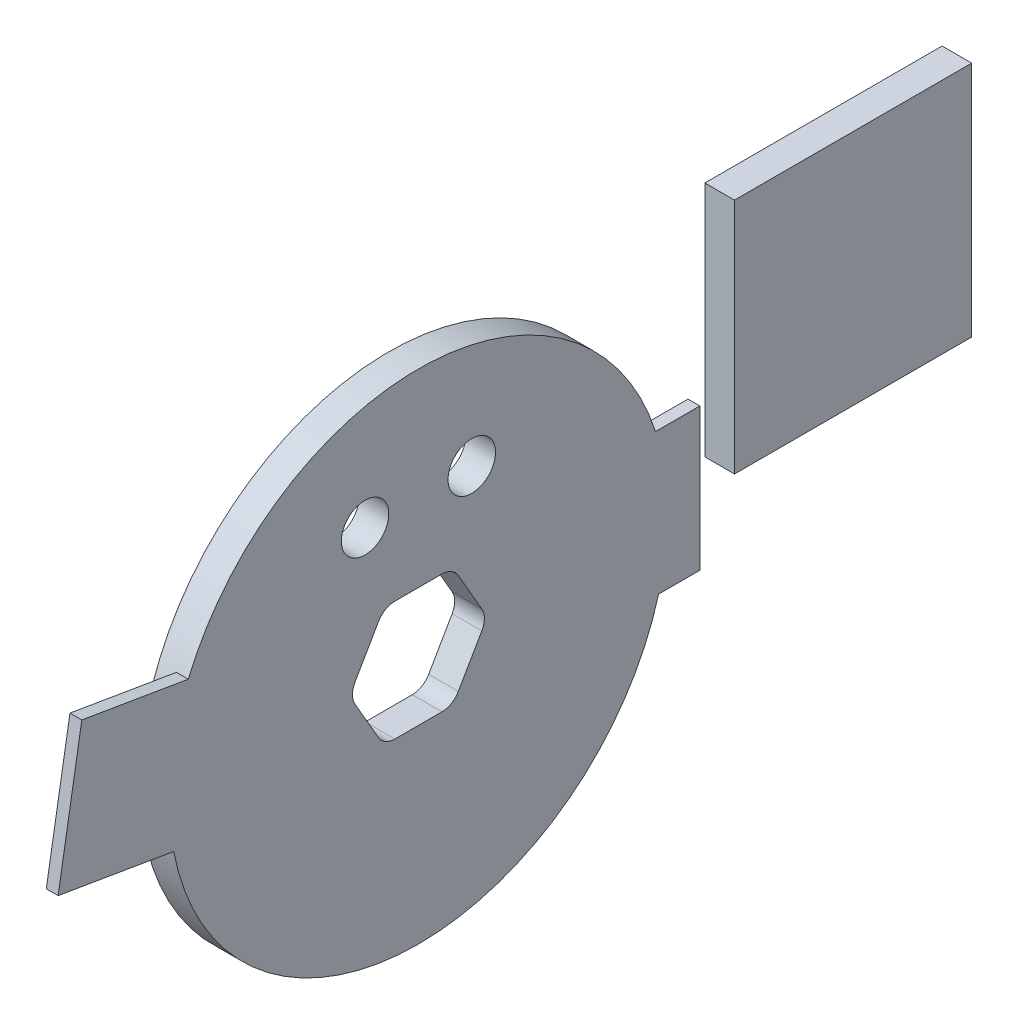
ISO-10303-21;
HEADER;
FILE_DESCRIPTION(('STEP AP214'),'2;1');
FILE_NAME('part.step','',(''),(''),'','','');
FILE_SCHEMA(('AUTOMOTIVE_DESIGN { 1 0 10303 214 1 1 1 1 }'));
ENDSEC;
DATA;
#1=APPLICATION_CONTEXT('core data for automotive mechanical design processes');
#2=APPLICATION_PROTOCOL_DEFINITION('international standard','automotive_design',2000,#1);
#3=PRODUCT_CONTEXT('',#1,'mechanical');
#4=PRODUCT('Part','Part','',(#3));
#5=PRODUCT_RELATED_PRODUCT_CATEGORY('part','',(#4));
#6=PRODUCT_DEFINITION_FORMATION('','',#4);
#7=PRODUCT_DEFINITION_CONTEXT('part definition',#1,'design');
#8=PRODUCT_DEFINITION('design','',#6,#7);
#9=PRODUCT_DEFINITION_SHAPE('','',#8);
#10=(LENGTH_UNIT() NAMED_UNIT(*) SI_UNIT(.MILLI.,.METRE.));
#11=(NAMED_UNIT(*) PLANE_ANGLE_UNIT() SI_UNIT($,.RADIAN.));
#12=(NAMED_UNIT(*) SI_UNIT($,.STERADIAN.) SOLID_ANGLE_UNIT());
#13=UNCERTAINTY_MEASURE_WITH_UNIT(LENGTH_MEASURE(1.E-05),#10,'distance_accuracy_value','');
#14=(GEOMETRIC_REPRESENTATION_CONTEXT(3) GLOBAL_UNCERTAINTY_ASSIGNED_CONTEXT((#13)) GLOBAL_UNIT_ASSIGNED_CONTEXT((#10,
#11,#12)) REPRESENTATION_CONTEXT('',''));
#15=CARTESIAN_POINT('',(0.,0.,0.));
#16=DIRECTION('',(0.,0.,1.));
#17=DIRECTION('',(1.,0.,0.));
#18=AXIS2_PLACEMENT_3D('',#15,#16,#17);
#19=CARTESIAN_POINT('',(-35.9210244842766,0.,-33.8423336393324));
#20=DIRECTION('',(0.,0.,1.));
#21=DIRECTION('',(0.,-1.,0.));
#22=AXIS2_PLACEMENT_3D('',#19,#20,#21);
#23=PLANE('',#22);
#24=DIRECTION('',(0.,1.,0.));
#25=VECTOR('',#24,1.);
#26=CARTESIAN_POINT('',(0.,0.,-33.8423336393324));
#27=LINE('',#26,#25);
#28=CARTESIAN_POINT('',(0.,0.,-33.8423336393324));
#29=VERTEX_POINT('',#28);
#30=CARTESIAN_POINT('',(0.,25.4,-33.8423336393324));
#31=VERTEX_POINT('',#30);
#32=EDGE_CURVE('E54',#29,#31,#27,.T.);
#33=ORIENTED_EDGE('',*,*,#32,.F.);
#34=DIRECTION('',(1.,0.,0.));
#35=VECTOR('',#34,1.);
#36=CARTESIAN_POINT('',(-35.9210244842766,0.,-33.8423336393324));
#37=LINE('',#36,#35);
#38=CARTESIAN_POINT('',(3.175,0.,-33.8423336393324));
#39=VERTEX_POINT('',#38);
#40=EDGE_CURVE('E82',#29,#39,#37,.T.);
#41=ORIENTED_EDGE('',*,*,#40,.T.);
#42=DIRECTION('',(0.,-1.,0.));
#43=VECTOR('',#42,1.);
#44=CARTESIAN_POINT('',(3.175,0.,-33.8423336393324));
#45=LINE('',#44,#43);
#46=CARTESIAN_POINT('',(3.175,25.4,-33.8423336393324));
#47=VERTEX_POINT('',#46);
#48=EDGE_CURVE('E86',#47,#39,#45,.T.);
#49=ORIENTED_EDGE('',*,*,#48,.F.);
#50=DIRECTION('',(1.,0.,0.));
#51=VECTOR('',#50,1.);
#52=CARTESIAN_POINT('',(-35.9210244842766,25.4,-33.8423336393324));
#53=LINE('',#52,#51);
#54=EDGE_CURVE('E109',#31,#47,#53,.T.);
#55=ORIENTED_EDGE('',*,*,#54,.F.);
#56=EDGE_LOOP('',(#33,#41,#49,#55));
#57=FACE_BOUND('',#56,.T.);
#58=ADVANCED_FACE('F46',(#57),#23,.T.);
#59=CARTESIAN_POINT('',(-35.9210244842766,25.4,-33.8423336393324));
#60=DIRECTION('',(0.,1.,0.));
#61=DIRECTION('',(0.,0.,1.));
#62=AXIS2_PLACEMENT_3D('',#59,#60,#61);
#63=PLANE('',#62);
#64=DIRECTION('',(0.,0.,-1.));
#65=VECTOR('',#64,1.);
#66=CARTESIAN_POINT('',(0.,25.4,-33.8423336393324));
#67=LINE('',#66,#65);
#68=CARTESIAN_POINT('',(0.,25.4,-59.2423336393324));
#69=VERTEX_POINT('',#68);
#70=EDGE_CURVE('E60',#31,#69,#67,.T.);
#71=ORIENTED_EDGE('',*,*,#70,.F.);
#72=ORIENTED_EDGE('',*,*,#54,.T.);
#73=DIRECTION('',(0.,0.,1.));
#74=VECTOR('',#73,1.);
#75=CARTESIAN_POINT('',(3.175,25.4,-33.8423336393324));
#76=LINE('',#75,#74);
#77=CARTESIAN_POINT('',(3.175,25.4,-59.2423336393324));
#78=VERTEX_POINT('',#77);
#79=EDGE_CURVE('E91',#78,#47,#76,.T.);
#80=ORIENTED_EDGE('',*,*,#79,.F.);
#81=DIRECTION('',(1.,0.,0.));
#82=VECTOR('',#81,1.);
#83=CARTESIAN_POINT('',(-35.9210244842766,25.4,-59.2423336393324));
#84=LINE('',#83,#82);
#85=EDGE_CURVE('E112',#69,#78,#84,.T.);
#86=ORIENTED_EDGE('',*,*,#85,.F.);
#87=EDGE_LOOP('',(#71,#72,#80,#86));
#88=FACE_BOUND('',#87,.T.);
#89=ADVANCED_FACE('F118',(#88),#63,.T.);
#90=CARTESIAN_POINT('',(-35.9210244842766,0.,-59.2423336393324));
#91=DIRECTION('',(0.,0.,-1.));
#92=DIRECTION('',(0.,1.,0.));
#93=AXIS2_PLACEMENT_3D('',#90,#91,#92);
#94=PLANE('',#93);
#95=DIRECTION('',(0.,-1.,0.));
#96=VECTOR('',#95,1.);
#97=CARTESIAN_POINT('',(0.,0.,-59.2423336393324));
#98=LINE('',#97,#96);
#99=CARTESIAN_POINT('',(0.,0.,-59.2423336393324));
#100=VERTEX_POINT('',#99);
#101=EDGE_CURVE('E111',#69,#100,#98,.T.);
#102=ORIENTED_EDGE('',*,*,#101,.F.);
#103=ORIENTED_EDGE('',*,*,#85,.T.);
#104=DIRECTION('',(0.,1.,0.));
#105=VECTOR('',#104,1.);
#106=CARTESIAN_POINT('',(3.175,0.,-59.2423336393324));
#107=LINE('',#106,#105);
#108=CARTESIAN_POINT('',(3.175,0.,-59.2423336393324));
#109=VERTEX_POINT('',#108);
#110=EDGE_CURVE('E99',#109,#78,#107,.T.);
#111=ORIENTED_EDGE('',*,*,#110,.F.);
#112=DIRECTION('',(1.,0.,0.));
#113=VECTOR('',#112,1.);
#114=CARTESIAN_POINT('',(-35.9210244842766,0.,-59.2423336393324));
#115=LINE('',#114,#113);
#116=EDGE_CURVE('E90',#100,#109,#115,.T.);
#117=ORIENTED_EDGE('',*,*,#116,.F.);
#118=EDGE_LOOP('',(#102,#103,#111,#117));
#119=FACE_BOUND('',#118,.T.);
#120=ADVANCED_FACE('F116',(#119),#94,.T.);
#121=CARTESIAN_POINT('',(-35.9210244842766,0.,-33.8423336393324));
#122=DIRECTION('',(0.,-1.,0.));
#123=DIRECTION('',(0.,0.,-1.));
#124=AXIS2_PLACEMENT_3D('',#121,#122,#123);
#125=PLANE('',#124);
#126=DIRECTION('',(0.,0.,1.));
#127=VECTOR('',#126,1.);
#128=CARTESIAN_POINT('',(0.,0.,-33.8423336393324));
#129=LINE('',#128,#127);
#130=EDGE_CURVE('E13',#100,#29,#129,.T.);
#131=ORIENTED_EDGE('',*,*,#130,.F.);
#132=ORIENTED_EDGE('',*,*,#116,.T.);
#133=DIRECTION('',(0.,0.,-1.));
#134=VECTOR('',#133,1.);
#135=CARTESIAN_POINT('',(3.175,0.,-33.8423336393324));
#136=LINE('',#135,#134);
#137=EDGE_CURVE('E93',#39,#109,#136,.T.);
#138=ORIENTED_EDGE('',*,*,#137,.F.);
#139=ORIENTED_EDGE('',*,*,#40,.F.);
#140=EDGE_LOOP('',(#131,#132,#138,#139));
#141=FACE_BOUND('',#140,.T.);
#142=ADVANCED_FACE('F94',(#141),#125,.T.);
#143=CARTESIAN_POINT('',(3.175,0.,0.));
#144=DIRECTION('',(-1.,0.,0.));
#145=DIRECTION('',(0.,0.,1.));
#146=AXIS2_PLACEMENT_3D('',#143,#144,#145);
#147=PLANE('',#146);
#148=ORIENTED_EDGE('',*,*,#48,.T.);
#149=ORIENTED_EDGE('',*,*,#137,.T.);
#150=ORIENTED_EDGE('',*,*,#110,.T.);
#151=ORIENTED_EDGE('',*,*,#79,.T.);
#152=EDGE_LOOP('',(#148,#149,#150,#151));
#153=FACE_BOUND('',#152,.T.);
#154=ADVANCED_FACE('F101',(#153),#147,.F.);
#155=CARTESIAN_POINT('',(0.,0.,0.));
#156=DIRECTION('',(1.,0.,0.));
#157=DIRECTION('',(0.,0.,-1.));
#158=AXIS2_PLACEMENT_3D('',#155,#156,#157);
#159=PLANE('',#158);
#160=ORIENTED_EDGE('',*,*,#32,.T.);
#161=ORIENTED_EDGE('',*,*,#70,.T.);
#162=ORIENTED_EDGE('',*,*,#101,.T.);
#163=ORIENTED_EDGE('',*,*,#130,.T.);
#164=EDGE_LOOP('',(#160,#161,#162,#163));
#165=FACE_BOUND('',#164,.T.);
#166=ADVANCED_FACE('F120',(#165),#159,.F.);
#167=CLOSED_SHELL('',(#58,#89,#120,#142,#154,#166));
#168=MANIFOLD_SOLID_BREP('B2',#167);
#169=CARTESIAN_POINT('',(3.175,0.,0.));
#170=DIRECTION('',(1.,0.,0.));
#171=DIRECTION('',(0.,0.,-1.));
#172=AXIS2_PLACEMENT_3D('',#169,#170,#171);
#173=PLANE('',#172);
#174=CARTESIAN_POINT('',(3.175,0.,0.));
#175=DIRECTION('',(-1.,0.,0.));
#176=DIRECTION('',(0.,0.,1.));
#177=AXIS2_PLACEMENT_3D('',#174,#175,#176);
#178=CIRCLE('',#177,26.67);
#179=CARTESIAN_POINT('',(3.175,-7.0730037867867,-25.7150056860212));
#180=VERTEX_POINT('',#179);
#181=CARTESIAN_POINT('',(3.175,-4.97628205618739,26.2016319510306));
#182=VERTEX_POINT('',#181);
#183=EDGE_CURVE('E361',#180,#182,#178,.T.);
#184=ORIENTED_EDGE('',*,*,#183,.F.);
#185=DIRECTION('',(0.,0.,-1.));
#186=VECTOR('',#185,1.);
#187=CARTESIAN_POINT('',(3.175,-7.0730037867867,-19.3009896519243));
#188=LINE('',#187,#186);
#189=CARTESIAN_POINT('',(3.175,-7.0730037867867,-30.1331847376147));
#190=VERTEX_POINT('',#189);
#191=EDGE_CURVE('E332',#180,#190,#188,.T.);
#192=ORIENTED_EDGE('',*,*,#191,.T.);
#193=DIRECTION('',(0.,1.,0.));
#194=VECTOR('',#193,1.);
#195=CARTESIAN_POINT('',(3.175,8.1669962132133,-30.1331847376147));
#196=LINE('',#195,#194);
#197=CARTESIAN_POINT('',(3.175,8.1669962132133,-30.1331847376147));
#198=VERTEX_POINT('',#197);
#199=EDGE_CURVE('E320',#190,#198,#196,.T.);
#200=ORIENTED_EDGE('',*,*,#199,.T.);
#201=DIRECTION('',(0.,0.,1.));
#202=VECTOR('',#201,1.);
#203=CARTESIAN_POINT('',(3.175,8.1669962132133,-19.3009896519243));
#204=LINE('',#203,#202);
#205=CARTESIAN_POINT('',(3.175,8.1669962132133,-25.3887587891445));
#206=VERTEX_POINT('',#205);
#207=EDGE_CURVE('E329',#198,#206,#204,.T.);
#208=ORIENTED_EDGE('',*,*,#207,.T.);
#209=CARTESIAN_POINT('',(3.175,10.2149040784678,24.6362463591291));
#210=VERTEX_POINT('',#209);
#211=EDGE_CURVE('E358',#210,#206,#178,.T.);
#212=ORIENTED_EDGE('',*,*,#211,.F.);
#213=DIRECTION('',(0.,0.166275518116075,0.986079333560556));
#214=VECTOR('',#213,1.);
#215=CARTESIAN_POINT('',(3.175,9.46466721300355,20.1870461600168));
#216=LINE('',#215,#214);
#217=CARTESIAN_POINT('',(3.175,12.1375221126456,36.0381287968679));
#218=VERTEX_POINT('',#217);
#219=EDGE_CURVE('E335',#210,#218,#216,.T.);
#220=ORIENTED_EDGE('',*,*,#219,.T.);
#221=DIRECTION('',(0.,-0.986079333560556,0.166275518116075));
#222=VECTOR('',#221,1.);
#223=CARTESIAN_POINT('',(3.175,12.1375221126456,36.0381287968679));
#224=LINE('',#223,#222);
#225=CARTESIAN_POINT('',(3.175,-2.89032693081725,38.5721676929568));
#226=VERTEX_POINT('',#225);
#227=EDGE_CURVE('E348',#218,#226,#224,.T.);
#228=ORIENTED_EDGE('',*,*,#227,.T.);
#229=DIRECTION('',(0.,-0.166275518116075,-0.986079333560556));
#230=VECTOR('',#229,1.);
#231=CARTESIAN_POINT('',(3.175,-5.56318183045933,22.7210850561058));
#232=LINE('',#231,#230);
#233=EDGE_CURVE('E340',#226,#182,#232,.T.);
#234=ORIENTED_EDGE('',*,*,#233,.T.);
#235=EDGE_LOOP('',(#184,#192,#200,#208,#212,#220,#228,#234));
#236=FACE_BOUND('',#235,.T.);
#237=DIRECTION('',(0.,0.,1.));
#238=VECTOR('',#237,1.);
#239=CARTESIAN_POINT('',(3.175,6.3881,-3.68817125461025));
#240=LINE('',#239,#238);
#241=CARTESIAN_POINT('',(3.175,6.3881,-2.51499550761693));
#242=VERTEX_POINT('',#241);
#243=CARTESIAN_POINT('',(3.175,6.3881,2.51499550761693));
#244=VERTEX_POINT('',#243);
#245=EDGE_CURVE('E458',#242,#244,#240,.T.);
#246=ORIENTED_EDGE('',*,*,#245,.F.);
#247=CARTESIAN_POINT('',(3.175,4.3561,-2.51499550761693));
#248=DIRECTION('',(1.,0.,0.));
#249=DIRECTION('',(0.,0.,-1.));
#250=AXIS2_PLACEMENT_3D('',#247,#248,#249);
#251=CIRCLE('',#250,2.032);
#252=CARTESIAN_POINT('',(3.175,5.3721,-4.27475912810691));
#253=VERTEX_POINT('',#252);
#254=EDGE_CURVE('E558',#242,#253,#251,.F.);
#255=ORIENTED_EDGE('',*,*,#254,.T.);
#256=DIRECTION('',(0.,0.866025403784438,0.5));
#257=VECTOR('',#256,1.);
#258=CARTESIAN_POINT('',(3.175,0.,-7.3763425092205));
#259=LINE('',#258,#257);
#260=CARTESIAN_POINT('',(3.175,1.016,-6.78975463572384));
#261=VERTEX_POINT('',#260);
#262=EDGE_CURVE('E379',#261,#253,#259,.T.);
#263=ORIENTED_EDGE('',*,*,#262,.F.);
#264=CARTESIAN_POINT('',(3.175,0.,-5.02999101523386));
#265=DIRECTION('',(1.,0.,0.));
#266=DIRECTION('',(0.,0.,-1.));
#267=AXIS2_PLACEMENT_3D('',#264,#265,#266);
#268=CIRCLE('',#267,2.032);
#269=CARTESIAN_POINT('',(3.175,-1.016,-6.78975463572384));
#270=VERTEX_POINT('',#269);
#271=EDGE_CURVE('E552',#261,#270,#268,.F.);
#272=ORIENTED_EDGE('',*,*,#271,.T.);
#273=DIRECTION('',(0.,0.866025403784439,-0.5));
#274=VECTOR('',#273,1.);
#275=CARTESIAN_POINT('',(3.175,-6.3881,-3.68817125461025));
#276=LINE('',#275,#274);
#277=CARTESIAN_POINT('',(3.175,-5.3721,-4.27475912810691));
#278=VERTEX_POINT('',#277);
#279=EDGE_CURVE('E386',#278,#270,#276,.T.);
#280=ORIENTED_EDGE('',*,*,#279,.F.);
#281=CARTESIAN_POINT('',(3.175,-4.3561,-2.51499550761693));
#282=DIRECTION('',(1.,0.,0.));
#283=DIRECTION('',(0.,0.,-1.));
#284=AXIS2_PLACEMENT_3D('',#281,#282,#283);
#285=CIRCLE('',#284,2.032);
#286=CARTESIAN_POINT('',(3.175,-6.3881,-2.51499550761693));
#287=VERTEX_POINT('',#286);
#288=EDGE_CURVE('E449',#278,#287,#285,.F.);
#289=ORIENTED_EDGE('',*,*,#288,.T.);
#290=DIRECTION('',(0.,0.,-1.));
#291=VECTOR('',#290,1.);
#292=CARTESIAN_POINT('',(3.175,-6.3881,3.68817125461024));
#293=LINE('',#292,#291);
#294=CARTESIAN_POINT('',(3.175,-6.3881,2.51499550761692));
#295=VERTEX_POINT('',#294);
#296=EDGE_CURVE('E467',#295,#287,#293,.T.);
#297=ORIENTED_EDGE('',*,*,#296,.F.);
#298=CARTESIAN_POINT('',(3.175,-4.3561,2.51499550761692));
#299=DIRECTION('',(1.,0.,0.));
#300=DIRECTION('',(0.,0.,-1.));
#301=AXIS2_PLACEMENT_3D('',#298,#299,#300);
#302=CIRCLE('',#301,2.032);
#303=CARTESIAN_POINT('',(3.175,-5.3721,4.2747591281069));
#304=VERTEX_POINT('',#303);
#305=EDGE_CURVE('E443',#295,#304,#302,.F.);
#306=ORIENTED_EDGE('',*,*,#305,.T.);
#307=DIRECTION('',(0.,-0.866025403784438,-0.5));
#308=VECTOR('',#307,1.);
#309=CARTESIAN_POINT('',(3.175,0.,7.3763425092205));
#310=LINE('',#309,#308);
#311=CARTESIAN_POINT('',(3.175,-1.016,6.78975463572383));
#312=VERTEX_POINT('',#311);
#313=EDGE_CURVE('E464',#312,#304,#310,.T.);
#314=ORIENTED_EDGE('',*,*,#313,.F.);
#315=CARTESIAN_POINT('',(3.175,0.,5.02999101523385));
#316=DIRECTION('',(1.,0.,0.));
#317=DIRECTION('',(0.,0.,-1.));
#318=AXIS2_PLACEMENT_3D('',#315,#316,#317);
#319=CIRCLE('',#318,2.032);
#320=CARTESIAN_POINT('',(3.175,1.016,6.78975463572383));
#321=VERTEX_POINT('',#320);
#322=EDGE_CURVE('E444',#312,#321,#319,.F.);
#323=ORIENTED_EDGE('',*,*,#322,.T.);
#324=DIRECTION('',(0.,-0.866025403784439,0.5));
#325=VECTOR('',#324,1.);
#326=CARTESIAN_POINT('',(3.175,6.3881,3.68817125461025));
#327=LINE('',#326,#325);
#328=CARTESIAN_POINT('',(3.175,5.3721,4.27475912810691));
#329=VERTEX_POINT('',#328);
#330=EDGE_CURVE('E461',#329,#321,#327,.T.);
#331=ORIENTED_EDGE('',*,*,#330,.F.);
#332=CARTESIAN_POINT('',(3.175,4.3561,2.51499550761693));
#333=DIRECTION('',(1.,0.,0.));
#334=DIRECTION('',(0.,0.,-1.));
#335=AXIS2_PLACEMENT_3D('',#332,#333,#334);
#336=CIRCLE('',#335,2.032);
#337=EDGE_CURVE('E417',#329,#244,#336,.F.);
#338=ORIENTED_EDGE('',*,*,#337,.T.);
#339=EDGE_LOOP('',(#246,#255,#263,#272,#280,#289,#297,#306,#314,#323,#331,#338));
#340=FACE_BOUND('',#339,.T.);
#341=CARTESIAN_POINT('',(3.175,14.8106178129071,5.715));
#342=DIRECTION('',(-1.,0.,0.));
#343=DIRECTION('',(0.,0.,1.));
#344=AXIS2_PLACEMENT_3D('',#341,#342,#343);
#345=CIRCLE('',#344,2.54);
#346=CARTESIAN_POINT('',(3.175,14.8106178129071,8.255));
#347=VERTEX_POINT('',#346);
#348=EDGE_CURVE('E455',#347,#347,#345,.T.);
#349=ORIENTED_EDGE('',*,*,#348,.T.);
#350=EDGE_LOOP('',(#349));
#351=FACE_BOUND('',#350,.T.);
#352=CARTESIAN_POINT('',(3.175,14.8106178129071,-5.715));
#353=DIRECTION('',(-1.,0.,0.));
#354=DIRECTION('',(0.,0.,1.));
#355=AXIS2_PLACEMENT_3D('',#352,#353,#354);
#356=CIRCLE('',#355,2.54);
#357=CARTESIAN_POINT('',(3.175,14.8106178129071,-3.175));
#358=VERTEX_POINT('',#357);
#359=EDGE_CURVE('E365',#358,#358,#356,.T.);
#360=ORIENTED_EDGE('',*,*,#359,.T.);
#361=EDGE_LOOP('',(#360));
#362=FACE_BOUND('',#361,.T.);
#363=ADVANCED_FACE('F171',(#236,#340,#351,#362),#173,.T.);
#364=CARTESIAN_POINT('',(0.,0.,0.));
#365=DIRECTION('',(1.,0.,0.));
#366=DIRECTION('',(0.,0.,-1.));
#367=AXIS2_PLACEMENT_3D('',#364,#365,#366);
#368=PLANE('',#367);
#369=DIRECTION('',(0.,0.866025403784439,-0.5));
#370=VECTOR('',#369,1.);
#371=CARTESIAN_POINT('',(0.,-6.3881,-3.68817125461025));
#372=LINE('',#371,#370);
#373=CARTESIAN_POINT('',(0.,-5.3721,-4.27475912810691));
#374=VERTEX_POINT('',#373);
#375=CARTESIAN_POINT('',(0.,-1.016,-6.78975463572384));
#376=VERTEX_POINT('',#375);
#377=EDGE_CURVE('E374',#374,#376,#372,.T.);
#378=ORIENTED_EDGE('',*,*,#377,.T.);
#379=CARTESIAN_POINT('',(0.,0.,-5.02999101523386));
#380=DIRECTION('',(1.,0.,0.));
#381=DIRECTION('',(0.,0.,-1.));
#382=AXIS2_PLACEMENT_3D('',#379,#380,#381);
#383=CIRCLE('',#382,2.032);
#384=CARTESIAN_POINT('',(0.,1.016,-6.78975463572384));
#385=VERTEX_POINT('',#384);
#386=EDGE_CURVE('E556',#376,#385,#383,.T.);
#387=ORIENTED_EDGE('',*,*,#386,.T.);
#388=DIRECTION('',(0.,0.866025403784438,0.5));
#389=VECTOR('',#388,1.);
#390=CARTESIAN_POINT('',(0.,0.,-7.3763425092205));
#391=LINE('',#390,#389);
#392=CARTESIAN_POINT('',(0.,5.3721,-4.27475912810691));
#393=VERTEX_POINT('',#392);
#394=EDGE_CURVE('E471',#385,#393,#391,.T.);
#395=ORIENTED_EDGE('',*,*,#394,.T.);
#396=CARTESIAN_POINT('',(0.,4.3561,-2.51499550761693));
#397=DIRECTION('',(1.,0.,0.));
#398=DIRECTION('',(0.,0.,-1.));
#399=AXIS2_PLACEMENT_3D('',#396,#397,#398);
#400=CIRCLE('',#399,2.032);
#401=CARTESIAN_POINT('',(0.,6.3881,-2.51499550761693));
#402=VERTEX_POINT('',#401);
#403=EDGE_CURVE('E555',#393,#402,#400,.T.);
#404=ORIENTED_EDGE('',*,*,#403,.T.);
#405=DIRECTION('',(0.,0.,1.));
#406=VECTOR('',#405,1.);
#407=CARTESIAN_POINT('',(0.,6.3881,-3.68817125461025));
#408=LINE('',#407,#406);
#409=CARTESIAN_POINT('',(0.,6.3881,2.51499550761693));
#410=VERTEX_POINT('',#409);
#411=EDGE_CURVE('E430',#402,#410,#408,.T.);
#412=ORIENTED_EDGE('',*,*,#411,.T.);
#413=CARTESIAN_POINT('',(0.,4.3561,2.51499550761693));
#414=DIRECTION('',(1.,0.,0.));
#415=DIRECTION('',(0.,0.,-1.));
#416=AXIS2_PLACEMENT_3D('',#413,#414,#415);
#417=CIRCLE('',#416,2.032);
#418=CARTESIAN_POINT('',(0.,5.3721,4.27475912810691));
#419=VERTEX_POINT('',#418);
#420=EDGE_CURVE('E414',#410,#419,#417,.T.);
#421=ORIENTED_EDGE('',*,*,#420,.T.);
#422=DIRECTION('',(0.,-0.866025403784439,0.5));
#423=VECTOR('',#422,1.);
#424=CARTESIAN_POINT('',(0.,6.3881,3.68817125461025));
#425=LINE('',#424,#423);
#426=CARTESIAN_POINT('',(0.,1.016,6.78975463572383));
#427=VERTEX_POINT('',#426);
#428=EDGE_CURVE('E426',#419,#427,#425,.T.);
#429=ORIENTED_EDGE('',*,*,#428,.T.);
#430=CARTESIAN_POINT('',(0.,0.,5.02999101523385));
#431=DIRECTION('',(1.,0.,0.));
#432=DIRECTION('',(0.,0.,-1.));
#433=AXIS2_PLACEMENT_3D('',#430,#431,#432);
#434=CIRCLE('',#433,2.032);
#435=CARTESIAN_POINT('',(0.,-1.016,6.78975463572383));
#436=VERTEX_POINT('',#435);
#437=EDGE_CURVE('E773',#427,#436,#434,.T.);
#438=ORIENTED_EDGE('',*,*,#437,.T.);
#439=DIRECTION('',(0.,-0.866025403784438,-0.5));
#440=VECTOR('',#439,1.);
#441=CARTESIAN_POINT('',(0.,0.,7.3763425092205));
#442=LINE('',#441,#440);
#443=CARTESIAN_POINT('',(0.,-5.3721,4.2747591281069));
#444=VERTEX_POINT('',#443);
#445=EDGE_CURVE('E429',#436,#444,#442,.T.);
#446=ORIENTED_EDGE('',*,*,#445,.T.);
#447=CARTESIAN_POINT('',(0.,-4.3561,2.51499550761692));
#448=DIRECTION('',(1.,0.,0.));
#449=DIRECTION('',(0.,0.,-1.));
#450=AXIS2_PLACEMENT_3D('',#447,#448,#449);
#451=CIRCLE('',#450,2.032);
#452=CARTESIAN_POINT('',(0.,-6.3881,2.51499550761692));
#453=VERTEX_POINT('',#452);
#454=EDGE_CURVE('E439',#444,#453,#451,.T.);
#455=ORIENTED_EDGE('',*,*,#454,.T.);
#456=DIRECTION('',(0.,0.,-1.));
#457=VECTOR('',#456,1.);
#458=CARTESIAN_POINT('',(0.,-6.3881,3.68817125461024));
#459=LINE('',#458,#457);
#460=CARTESIAN_POINT('',(0.,-6.3881,-2.51499550761693));
#461=VERTEX_POINT('',#460);
#462=EDGE_CURVE('E380',#453,#461,#459,.T.);
#463=ORIENTED_EDGE('',*,*,#462,.T.);
#464=CARTESIAN_POINT('',(0.,-4.3561,-2.51499550761693));
#465=DIRECTION('',(1.,0.,0.));
#466=DIRECTION('',(0.,0.,-1.));
#467=AXIS2_PLACEMENT_3D('',#464,#465,#466);
#468=CIRCLE('',#467,2.032);
#469=EDGE_CURVE('E446',#461,#374,#468,.T.);
#470=ORIENTED_EDGE('',*,*,#469,.T.);
#471=EDGE_LOOP('',(#378,#387,#395,#404,#412,#421,#429,#438,#446,#455,#463,#470));
#472=FACE_BOUND('',#471,.T.);
#473=CARTESIAN_POINT('',(0.,14.8106178129071,5.715));
#474=DIRECTION('',(-1.,0.,0.));
#475=DIRECTION('',(0.,0.,1.));
#476=AXIS2_PLACEMENT_3D('',#473,#474,#475);
#477=CIRCLE('',#476,2.54);
#478=CARTESIAN_POINT('',(0.,14.8106178129071,8.255));
#479=VERTEX_POINT('',#478);
#480=EDGE_CURVE('E360',#479,#479,#477,.T.);
#481=ORIENTED_EDGE('',*,*,#480,.F.);
#482=EDGE_LOOP('',(#481));
#483=FACE_BOUND('',#482,.T.);
#484=CARTESIAN_POINT('',(0.,14.8106178129071,-5.715));
#485=DIRECTION('',(-1.,0.,0.));
#486=DIRECTION('',(0.,0.,1.));
#487=AXIS2_PLACEMENT_3D('',#484,#485,#486);
#488=CIRCLE('',#487,2.54);
#489=CARTESIAN_POINT('',(0.,14.8106178129071,-3.175));
#490=VERTEX_POINT('',#489);
#491=EDGE_CURVE('E478',#490,#490,#488,.T.);
#492=ORIENTED_EDGE('',*,*,#491,.F.);
#493=EDGE_LOOP('',(#492));
#494=FACE_BOUND('',#493,.T.);
#495=CARTESIAN_POINT('',(0.,0.,0.));
#496=DIRECTION('',(-1.,0.,0.));
#497=DIRECTION('',(0.,0.,1.));
#498=AXIS2_PLACEMENT_3D('',#495,#496,#497);
#499=CIRCLE('',#498,26.67);
#500=CARTESIAN_POINT('',(0.,0.,26.67));
#501=VERTEX_POINT('',#500);
#502=EDGE_CURVE('E355',#501,#501,#499,.T.);
#503=ORIENTED_EDGE('',*,*,#502,.T.);
#504=EDGE_LOOP('',(#503));
#505=FACE_BOUND('',#504,.T.);
#506=ADVANCED_FACE('F496',(#472,#483,#494,#505),#368,.F.);
#507=CARTESIAN_POINT('',(3.175,0.,-7.3763425092205));
#508=DIRECTION('',(0.,-0.5,0.866025403784438));
#509=DIRECTION('',(0.,-0.866025403784439,-0.5));
#510=AXIS2_PLACEMENT_3D('',#507,#508,#509);
#511=PLANE('',#510);
#512=ORIENTED_EDGE('',*,*,#394,.F.);
#513=DIRECTION('',(-1.,0.,0.));
#514=VECTOR('',#513,1.);
#515=CARTESIAN_POINT('',(3.175,1.016,-6.78975463572384));
#516=LINE('',#515,#514);
#517=EDGE_CURVE('E412',#385,#261,#516,.F.);
#518=ORIENTED_EDGE('',*,*,#517,.T.);
#519=ORIENTED_EDGE('',*,*,#262,.T.);
#520=DIRECTION('',(-1.,0.,0.));
#521=VECTOR('',#520,1.);
#522=CARTESIAN_POINT('',(0.,5.3721,-4.27475912810691));
#523=LINE('',#522,#521);
#524=EDGE_CURVE('E409',#253,#393,#523,.T.);
#525=ORIENTED_EDGE('',*,*,#524,.T.);
#526=EDGE_LOOP('',(#512,#518,#519,#525));
#527=FACE_BOUND('',#526,.T.);
#528=ADVANCED_FACE('F499',(#527),#511,.T.);
#529=CARTESIAN_POINT('',(3.175,6.3881,-3.68817125461025));
#530=DIRECTION('',(0.,-1.,0.));
#531=DIRECTION('',(0.,0.,-1.));
#532=AXIS2_PLACEMENT_3D('',#529,#530,#531);
#533=PLANE('',#532);
#534=ORIENTED_EDGE('',*,*,#245,.T.);
#535=DIRECTION('',(-1.,0.,0.));
#536=VECTOR('',#535,1.);
#537=CARTESIAN_POINT('',(0.,6.3881,2.51499550761693));
#538=LINE('',#537,#536);
#539=EDGE_CURVE('E385',#244,#410,#538,.T.);
#540=ORIENTED_EDGE('',*,*,#539,.T.);
#541=ORIENTED_EDGE('',*,*,#411,.F.);
#542=DIRECTION('',(-1.,0.,0.));
#543=VECTOR('',#542,1.);
#544=CARTESIAN_POINT('',(3.175,6.3881,-2.51499550761693));
#545=LINE('',#544,#543);
#546=EDGE_CURVE('E383',#402,#242,#545,.F.);
#547=ORIENTED_EDGE('',*,*,#546,.T.);
#548=EDGE_LOOP('',(#534,#540,#541,#547));
#549=FACE_BOUND('',#548,.T.);
#550=ADVANCED_FACE('F740',(#549),#533,.T.);
#551=CARTESIAN_POINT('',(3.175,6.3881,3.68817125461025));
#552=DIRECTION('',(0.,-0.5,-0.866025403784439));
#553=DIRECTION('',(0.,0.866025403784439,-0.5));
#554=AXIS2_PLACEMENT_3D('',#551,#552,#553);
#555=PLANE('',#554);
#556=ORIENTED_EDGE('',*,*,#428,.F.);
#557=DIRECTION('',(-1.,0.,0.));
#558=VECTOR('',#557,1.);
#559=CARTESIAN_POINT('',(3.175,5.3721,4.27475912810691));
#560=LINE('',#559,#558);
#561=EDGE_CURVE('E392',#419,#329,#560,.F.);
#562=ORIENTED_EDGE('',*,*,#561,.T.);
#563=ORIENTED_EDGE('',*,*,#330,.T.);
#564=DIRECTION('',(-1.,0.,0.));
#565=VECTOR('',#564,1.);
#566=CARTESIAN_POINT('',(0.,1.016,6.78975463572383));
#567=LINE('',#566,#565);
#568=EDGE_CURVE('E389',#321,#427,#567,.T.);
#569=ORIENTED_EDGE('',*,*,#568,.T.);
#570=EDGE_LOOP('',(#556,#562,#563,#569));
#571=FACE_BOUND('',#570,.T.);
#572=ADVANCED_FACE('F730',(#571),#555,.T.);
#573=CARTESIAN_POINT('',(3.175,0.,7.3763425092205));
#574=DIRECTION('',(0.,0.5,-0.866025403784438));
#575=DIRECTION('',(0.,0.866025403784439,0.5));
#576=AXIS2_PLACEMENT_3D('',#573,#574,#575);
#577=PLANE('',#576);
#578=ORIENTED_EDGE('',*,*,#445,.F.);
#579=DIRECTION('',(-1.,0.,0.));
#580=VECTOR('',#579,1.);
#581=CARTESIAN_POINT('',(3.175,-1.016,6.78975463572383));
#582=LINE('',#581,#580);
#583=EDGE_CURVE('E397',#436,#312,#582,.F.);
#584=ORIENTED_EDGE('',*,*,#583,.T.);
#585=ORIENTED_EDGE('',*,*,#313,.T.);
#586=DIRECTION('',(-1.,0.,0.));
#587=VECTOR('',#586,1.);
#588=CARTESIAN_POINT('',(0.,-5.3721,4.2747591281069));
#589=LINE('',#588,#587);
#590=EDGE_CURVE('E394',#304,#444,#589,.T.);
#591=ORIENTED_EDGE('',*,*,#590,.T.);
#592=EDGE_LOOP('',(#578,#584,#585,#591));
#593=FACE_BOUND('',#592,.T.);
#594=ADVANCED_FACE('F720',(#593),#577,.T.);
#595=CARTESIAN_POINT('',(3.175,-6.3881,3.68817125461024));
#596=DIRECTION('',(0.,1.,0.));
#597=DIRECTION('',(0.,0.,1.));
#598=AXIS2_PLACEMENT_3D('',#595,#596,#597);
#599=PLANE('',#598);
#600=ORIENTED_EDGE('',*,*,#462,.F.);
#601=DIRECTION('',(-1.,0.,0.));
#602=VECTOR('',#601,1.);
#603=CARTESIAN_POINT('',(3.175,-6.3881,2.51499550761692));
#604=LINE('',#603,#602);
#605=EDGE_CURVE('E402',#453,#295,#604,.F.);
#606=ORIENTED_EDGE('',*,*,#605,.T.);
#607=ORIENTED_EDGE('',*,*,#296,.T.);
#608=DIRECTION('',(-1.,0.,0.));
#609=VECTOR('',#608,1.);
#610=CARTESIAN_POINT('',(0.,-6.3881,-2.51499550761693));
#611=LINE('',#610,#609);
#612=EDGE_CURVE('E399',#287,#461,#611,.T.);
#613=ORIENTED_EDGE('',*,*,#612,.T.);
#614=EDGE_LOOP('',(#600,#606,#607,#613));
#615=FACE_BOUND('',#614,.T.);
#616=ADVANCED_FACE('F710',(#615),#599,.T.);
#617=CARTESIAN_POINT('',(3.175,-6.3881,-3.68817125461025));
#618=DIRECTION('',(0.,0.5,0.866025403784439));
#619=DIRECTION('',(0.,-0.866025403784439,0.5));
#620=AXIS2_PLACEMENT_3D('',#617,#618,#619);
#621=PLANE('',#620);
#622=ORIENTED_EDGE('',*,*,#377,.F.);
#623=DIRECTION('',(-1.,0.,0.));
#624=VECTOR('',#623,1.);
#625=CARTESIAN_POINT('',(3.175,-5.3721,-4.27475912810691));
#626=LINE('',#625,#624);
#627=EDGE_CURVE('E407',#374,#278,#626,.F.);
#628=ORIENTED_EDGE('',*,*,#627,.T.);
#629=ORIENTED_EDGE('',*,*,#279,.T.);
#630=DIRECTION('',(-1.,0.,0.));
#631=VECTOR('',#630,1.);
#632=CARTESIAN_POINT('',(0.,-1.016,-6.78975463572384));
#633=LINE('',#632,#631);
#634=EDGE_CURVE('E404',#270,#376,#633,.T.);
#635=ORIENTED_EDGE('',*,*,#634,.T.);
#636=EDGE_LOOP('',(#622,#628,#629,#635));
#637=FACE_BOUND('',#636,.T.);
#638=ADVANCED_FACE('F530',(#637),#621,.T.);
#639=CARTESIAN_POINT('',(3.175,4.3561,2.51499550761693));
#640=DIRECTION('',(1.,0.,0.));
#641=DIRECTION('',(0.,0.,-1.));
#642=AXIS2_PLACEMENT_3D('',#639,#640,#641);
#643=CYLINDRICAL_SURFACE('',#642,2.032);
#644=ORIENTED_EDGE('',*,*,#337,.F.);
#645=ORIENTED_EDGE('',*,*,#561,.F.);
#646=ORIENTED_EDGE('',*,*,#420,.F.);
#647=ORIENTED_EDGE('',*,*,#539,.F.);
#648=EDGE_LOOP('',(#644,#645,#646,#647));
#649=FACE_BOUND('',#648,.T.);
#650=ADVANCED_FACE('F526',(#649),#643,.F.);
#651=CARTESIAN_POINT('',(3.175,0.,5.02999101523385));
#652=DIRECTION('',(1.,0.,0.));
#653=DIRECTION('',(0.,0.,-1.));
#654=AXIS2_PLACEMENT_3D('',#651,#652,#653);
#655=CYLINDRICAL_SURFACE('',#654,2.032);
#656=ORIENTED_EDGE('',*,*,#322,.F.);
#657=ORIENTED_EDGE('',*,*,#583,.F.);
#658=ORIENTED_EDGE('',*,*,#437,.F.);
#659=ORIENTED_EDGE('',*,*,#568,.F.);
#660=EDGE_LOOP('',(#656,#657,#658,#659));
#661=FACE_BOUND('',#660,.T.);
#662=ADVANCED_FACE('F529',(#661),#655,.F.);
#663=CARTESIAN_POINT('',(3.175,-4.3561,2.51499550761692));
#664=DIRECTION('',(1.,0.,0.));
#665=DIRECTION('',(0.,0.,-1.));
#666=AXIS2_PLACEMENT_3D('',#663,#664,#665);
#667=CYLINDRICAL_SURFACE('',#666,2.032);
#668=ORIENTED_EDGE('',*,*,#305,.F.);
#669=ORIENTED_EDGE('',*,*,#605,.F.);
#670=ORIENTED_EDGE('',*,*,#454,.F.);
#671=ORIENTED_EDGE('',*,*,#590,.F.);
#672=EDGE_LOOP('',(#668,#669,#670,#671));
#673=FACE_BOUND('',#672,.T.);
#674=ADVANCED_FACE('F534',(#673),#667,.F.);
#675=CARTESIAN_POINT('',(3.175,-4.3561,-2.51499550761693));
#676=DIRECTION('',(1.,0.,0.));
#677=DIRECTION('',(0.,0.,-1.));
#678=AXIS2_PLACEMENT_3D('',#675,#676,#677);
#679=CYLINDRICAL_SURFACE('',#678,2.032);
#680=ORIENTED_EDGE('',*,*,#288,.F.);
#681=ORIENTED_EDGE('',*,*,#627,.F.);
#682=ORIENTED_EDGE('',*,*,#469,.F.);
#683=ORIENTED_EDGE('',*,*,#612,.F.);
#684=EDGE_LOOP('',(#680,#681,#682,#683));
#685=FACE_BOUND('',#684,.T.);
#686=ADVANCED_FACE('F538',(#685),#679,.F.);
#687=CARTESIAN_POINT('',(3.175,0.,-5.02999101523386));
#688=DIRECTION('',(1.,0.,0.));
#689=DIRECTION('',(0.,0.,-1.));
#690=AXIS2_PLACEMENT_3D('',#687,#688,#689);
#691=CYLINDRICAL_SURFACE('',#690,2.032);
#692=ORIENTED_EDGE('',*,*,#271,.F.);
#693=ORIENTED_EDGE('',*,*,#517,.F.);
#694=ORIENTED_EDGE('',*,*,#386,.F.);
#695=ORIENTED_EDGE('',*,*,#634,.F.);
#696=EDGE_LOOP('',(#692,#693,#694,#695));
#697=FACE_BOUND('',#696,.T.);
#698=ADVANCED_FACE('F541',(#697),#691,.F.);
#699=CARTESIAN_POINT('',(3.175,4.3561,-2.51499550761693));
#700=DIRECTION('',(1.,0.,0.));
#701=DIRECTION('',(0.,0.,-1.));
#702=AXIS2_PLACEMENT_3D('',#699,#700,#701);
#703=CYLINDRICAL_SURFACE('',#702,2.032);
#704=ORIENTED_EDGE('',*,*,#254,.F.);
#705=ORIENTED_EDGE('',*,*,#546,.F.);
#706=ORIENTED_EDGE('',*,*,#403,.F.);
#707=ORIENTED_EDGE('',*,*,#524,.F.);
#708=EDGE_LOOP('',(#704,#705,#706,#707));
#709=FACE_BOUND('',#708,.T.);
#710=ADVANCED_FACE('F173',(#709),#703,.F.);
#711=CARTESIAN_POINT('',(3.175,14.8106178129071,5.715));
#712=DIRECTION('',(-1.,0.,0.));
#713=DIRECTION('',(0.,0.,1.));
#714=AXIS2_PLACEMENT_3D('',#711,#712,#713);
#715=CYLINDRICAL_SURFACE('',#714,2.54);
#716=ORIENTED_EDGE('',*,*,#348,.F.);
#717=EDGE_LOOP('',(#716));
#718=FACE_BOUND('',#717,.T.);
#719=ORIENTED_EDGE('',*,*,#480,.T.);
#720=EDGE_LOOP('',(#719));
#721=FACE_BOUND('',#720,.T.);
#722=ADVANCED_FACE('F489',(#718,#721),#715,.F.);
#723=CARTESIAN_POINT('',(3.175,14.8106178129071,-5.715));
#724=DIRECTION('',(-1.,0.,0.));
#725=DIRECTION('',(0.,0.,1.));
#726=AXIS2_PLACEMENT_3D('',#723,#724,#725);
#727=CYLINDRICAL_SURFACE('',#726,2.54);
#728=ORIENTED_EDGE('',*,*,#359,.F.);
#729=EDGE_LOOP('',(#728));
#730=FACE_BOUND('',#729,.T.);
#731=ORIENTED_EDGE('',*,*,#491,.T.);
#732=EDGE_LOOP('',(#731));
#733=FACE_BOUND('',#732,.T.);
#734=ADVANCED_FACE('F492',(#730,#733),#727,.F.);
#735=CARTESIAN_POINT('',(3.175,0.,0.));
#736=DIRECTION('',(-1.,0.,0.));
#737=DIRECTION('',(0.,0.,1.));
#738=AXIS2_PLACEMENT_3D('',#735,#736,#737);
#739=CYLINDRICAL_SURFACE('',#738,26.67);
#740=DIRECTION('',(-1.,0.,0.));
#741=VECTOR('',#740,1.);
#742=CARTESIAN_POINT('',(3.175,8.1669962132133,-25.3887587891445));
#743=LINE('',#742,#741);
#744=CARTESIAN_POINT('',(1.905,8.1669962132133,-25.3887587891445));
#745=VERTEX_POINT('',#744);
#746=EDGE_CURVE('E44',#745,#206,#743,.F.);
#747=ORIENTED_EDGE('',*,*,#746,.F.);
#748=CARTESIAN_POINT('',(1.905,0.,0.));
#749=DIRECTION('',(-1.,0.,0.));
#750=DIRECTION('',(0.,0.,1.));
#751=AXIS2_PLACEMENT_3D('',#748,#749,#750);
#752=CIRCLE('',#751,26.67);
#753=CARTESIAN_POINT('',(1.905,-7.0730037867867,-25.7150056860212));
#754=VERTEX_POINT('',#753);
#755=EDGE_CURVE('E188',#754,#745,#752,.F.);
#756=ORIENTED_EDGE('',*,*,#755,.F.);
#757=DIRECTION('',(-1.,0.,0.));
#758=VECTOR('',#757,1.);
#759=CARTESIAN_POINT('',(3.175,-7.0730037867867,-25.7150056860212));
#760=LINE('',#759,#758);
#761=EDGE_CURVE('E179',#180,#754,#760,.T.);
#762=ORIENTED_EDGE('',*,*,#761,.F.);
#763=ORIENTED_EDGE('',*,*,#183,.T.);
#764=DIRECTION('',(-1.,0.,0.));
#765=VECTOR('',#764,1.);
#766=CARTESIAN_POINT('',(3.175,-4.97628205618739,26.2016319510306));
#767=LINE('',#766,#765);
#768=CARTESIAN_POINT('',(1.905,-4.97628205618739,26.2016319510306));
#769=VERTEX_POINT('',#768);
#770=EDGE_CURVE('E565',#769,#182,#767,.F.);
#771=ORIENTED_EDGE('',*,*,#770,.F.);
#772=CARTESIAN_POINT('',(1.905,0.,0.));
#773=DIRECTION('',(1.,0.,0.));
#774=DIRECTION('',(0.,0.,-1.));
#775=AXIS2_PLACEMENT_3D('',#772,#773,#774);
#776=CIRCLE('',#775,26.67);
#777=CARTESIAN_POINT('',(1.905,10.2149040784678,24.6362463591291));
#778=VERTEX_POINT('',#777);
#779=EDGE_CURVE('E563',#769,#778,#776,.F.);
#780=ORIENTED_EDGE('',*,*,#779,.T.);
#781=DIRECTION('',(-1.,0.,0.));
#782=VECTOR('',#781,1.);
#783=CARTESIAN_POINT('',(3.175,10.2149040784678,24.6362463591291));
#784=LINE('',#783,#782);
#785=EDGE_CURVE('E568',#210,#778,#784,.T.);
#786=ORIENTED_EDGE('',*,*,#785,.F.);
#787=ORIENTED_EDGE('',*,*,#211,.T.);
#788=EDGE_LOOP('',(#747,#756,#762,#763,#771,#780,#786,#787));
#789=FACE_BOUND('',#788,.T.);
#790=ORIENTED_EDGE('',*,*,#502,.F.);
#791=EDGE_LOOP('',(#790));
#792=FACE_BOUND('',#791,.T.);
#793=ADVANCED_FACE('F504',(#789,#792),#739,.T.);
#794=CARTESIAN_POINT('',(1.905,9.46466721300355,20.1870461600168));
#795=DIRECTION('',(0.,0.986079333560556,-0.166275518116075));
#796=DIRECTION('',(0.,0.166275518116075,0.986079333560556));
#797=AXIS2_PLACEMENT_3D('',#794,#795,#796);
#798=PLANE('',#797);
#799=ORIENTED_EDGE('',*,*,#219,.F.);
#800=ORIENTED_EDGE('',*,*,#785,.T.);
#801=DIRECTION('',(0.,0.166275518116075,0.986079333560556));
#802=VECTOR('',#801,1.);
#803=CARTESIAN_POINT('',(1.905,9.46466721300355,20.1870461600168));
#804=LINE('',#803,#802);
#805=CARTESIAN_POINT('',(1.905,12.1375221126456,36.0381287968679));
#806=VERTEX_POINT('',#805);
#807=EDGE_CURVE('E337',#778,#806,#804,.T.);
#808=ORIENTED_EDGE('',*,*,#807,.T.);
#809=DIRECTION('',(1.,0.,0.));
#810=VECTOR('',#809,1.);
#811=CARTESIAN_POINT('',(1.905,12.1375221126456,36.0381287968679));
#812=LINE('',#811,#810);
#813=EDGE_CURVE('E346',#806,#218,#812,.T.);
#814=ORIENTED_EDGE('',*,*,#813,.T.);
#815=EDGE_LOOP('',(#799,#800,#808,#814));
#816=FACE_BOUND('',#815,.T.);
#817=ADVANCED_FACE('F506',(#816),#798,.T.);
#818=CARTESIAN_POINT('',(1.905,-5.56318183045933,22.7210850561058));
#819=DIRECTION('',(0.,-0.986079333560556,0.166275518116075));
#820=DIRECTION('',(0.,-0.166275518116075,-0.986079333560556));
#821=AXIS2_PLACEMENT_3D('',#818,#819,#820);
#822=PLANE('',#821);
#823=DIRECTION('',(0.,-0.166275518116075,-0.986079333560556));
#824=VECTOR('',#823,1.);
#825=CARTESIAN_POINT('',(1.905,-5.56318183045933,22.7210850561058));
#826=LINE('',#825,#824);
#827=CARTESIAN_POINT('',(1.905,-2.89032693081725,38.5721676929568));
#828=VERTEX_POINT('',#827);
#829=EDGE_CURVE('E343',#828,#769,#826,.T.);
#830=ORIENTED_EDGE('',*,*,#829,.T.);
#831=ORIENTED_EDGE('',*,*,#770,.T.);
#832=ORIENTED_EDGE('',*,*,#233,.F.);
#833=DIRECTION('',(1.,0.,0.));
#834=VECTOR('',#833,1.);
#835=CARTESIAN_POINT('',(1.905,-2.89032693081725,38.5721676929568));
#836=LINE('',#835,#834);
#837=EDGE_CURVE('E353',#828,#226,#836,.T.);
#838=ORIENTED_EDGE('',*,*,#837,.F.);
#839=EDGE_LOOP('',(#830,#831,#832,#838));
#840=FACE_BOUND('',#839,.T.);
#841=ADVANCED_FACE('F512',(#840),#822,.T.);
#842=CARTESIAN_POINT('',(1.905,12.1375221126456,36.0381287968679));
#843=DIRECTION('',(0.,0.166275518116075,0.986079333560556));
#844=DIRECTION('',(0.,-0.986079333560556,0.166275518116075));
#845=AXIS2_PLACEMENT_3D('',#842,#843,#844);
#846=PLANE('',#845);
#847=ORIENTED_EDGE('',*,*,#227,.F.);
#848=ORIENTED_EDGE('',*,*,#813,.F.);
#849=DIRECTION('',(0.,-0.986079333560556,0.166275518116075));
#850=VECTOR('',#849,1.);
#851=CARTESIAN_POINT('',(1.905,12.1375221126456,36.0381287968679));
#852=LINE('',#851,#850);
#853=EDGE_CURVE('E339',#806,#828,#852,.T.);
#854=ORIENTED_EDGE('',*,*,#853,.T.);
#855=ORIENTED_EDGE('',*,*,#837,.T.);
#856=EDGE_LOOP('',(#847,#848,#854,#855));
#857=FACE_BOUND('',#856,.T.);
#858=ADVANCED_FACE('F585',(#857),#846,.T.);
#859=CARTESIAN_POINT('',(1.905,0.,0.));
#860=DIRECTION('',(1.,0.,0.));
#861=DIRECTION('',(0.,0.,-1.));
#862=AXIS2_PLACEMENT_3D('',#859,#860,#861);
#863=PLANE('',#862);
#864=ORIENTED_EDGE('',*,*,#779,.F.);
#865=ORIENTED_EDGE('',*,*,#829,.F.);
#866=ORIENTED_EDGE('',*,*,#853,.F.);
#867=ORIENTED_EDGE('',*,*,#807,.F.);
#868=EDGE_LOOP('',(#864,#865,#866,#867));
#869=FACE_BOUND('',#868,.T.);
#870=ADVANCED_FACE('F580',(#869),#863,.F.);
#871=CARTESIAN_POINT('',(1.905,8.1669962132133,-19.3009896519243));
#872=DIRECTION('',(0.,1.,0.));
#873=DIRECTION('',(0.,0.,1.));
#874=AXIS2_PLACEMENT_3D('',#871,#872,#873);
#875=PLANE('',#874);
#876=DIRECTION('',(0.,0.,1.));
#877=VECTOR('',#876,1.);
#878=CARTESIAN_POINT('',(1.905,8.1669962132133,-19.3009896519243));
#879=LINE('',#878,#877);
#880=CARTESIAN_POINT('',(1.905,8.1669962132133,-30.1331847376147));
#881=VERTEX_POINT('',#880);
#882=EDGE_CURVE('E314',#881,#745,#879,.T.);
#883=ORIENTED_EDGE('',*,*,#882,.T.);
#884=ORIENTED_EDGE('',*,*,#746,.T.);
#885=ORIENTED_EDGE('',*,*,#207,.F.);
#886=DIRECTION('',(1.,0.,0.));
#887=VECTOR('',#886,1.);
#888=CARTESIAN_POINT('',(1.905,8.1669962132133,-30.1331847376147));
#889=LINE('',#888,#887);
#890=EDGE_CURVE('E321',#881,#198,#889,.T.);
#891=ORIENTED_EDGE('',*,*,#890,.F.);
#892=EDGE_LOOP('',(#883,#884,#885,#891));
#893=FACE_BOUND('',#892,.T.);
#894=ADVANCED_FACE('F572',(#893),#875,.T.);
#895=CARTESIAN_POINT('',(1.905,8.1669962132133,-30.1331847376147));
#896=DIRECTION('',(0.,0.,-1.));
#897=DIRECTION('',(0.,1.,0.));
#898=AXIS2_PLACEMENT_3D('',#895,#896,#897);
#899=PLANE('',#898);
#900=ORIENTED_EDGE('',*,*,#199,.F.);
#901=DIRECTION('',(1.,0.,0.));
#902=VECTOR('',#901,1.);
#903=CARTESIAN_POINT('',(1.905,-7.0730037867867,-30.1331847376147));
#904=LINE('',#903,#902);
#905=CARTESIAN_POINT('',(1.905,-7.0730037867867,-30.1331847376147));
#906=VERTEX_POINT('',#905);
#907=EDGE_CURVE('E309',#906,#190,#904,.T.);
#908=ORIENTED_EDGE('',*,*,#907,.F.);
#909=DIRECTION('',(0.,1.,0.));
#910=VECTOR('',#909,1.);
#911=CARTESIAN_POINT('',(1.905,8.1669962132133,-30.1331847376147));
#912=LINE('',#911,#910);
#913=EDGE_CURVE('E313',#906,#881,#912,.T.);
#914=ORIENTED_EDGE('',*,*,#913,.T.);
#915=ORIENTED_EDGE('',*,*,#890,.T.);
#916=EDGE_LOOP('',(#900,#908,#914,#915));
#917=FACE_BOUND('',#916,.T.);
#918=ADVANCED_FACE('F318',(#917),#899,.T.);
#919=CARTESIAN_POINT('',(1.905,-7.0730037867867,-19.3009896519243));
#920=DIRECTION('',(0.,-1.,0.));
#921=DIRECTION('',(0.,0.,-1.));
#922=AXIS2_PLACEMENT_3D('',#919,#920,#921);
#923=PLANE('',#922);
#924=ORIENTED_EDGE('',*,*,#191,.F.);
#925=ORIENTED_EDGE('',*,*,#761,.T.);
#926=DIRECTION('',(0.,0.,-1.));
#927=VECTOR('',#926,1.);
#928=CARTESIAN_POINT('',(1.905,-7.0730037867867,-19.3009896519243));
#929=LINE('',#928,#927);
#930=EDGE_CURVE('E305',#754,#906,#929,.T.);
#931=ORIENTED_EDGE('',*,*,#930,.T.);
#932=ORIENTED_EDGE('',*,*,#907,.T.);
#933=EDGE_LOOP('',(#924,#925,#931,#932));
#934=FACE_BOUND('',#933,.T.);
#935=ADVANCED_FACE('F308',(#934),#923,.T.);
#936=CARTESIAN_POINT('',(1.905,0.,0.));
#937=DIRECTION('',(-1.,0.,0.));
#938=DIRECTION('',(0.,0.,1.));
#939=AXIS2_PLACEMENT_3D('',#936,#937,#938);
#940=PLANE('',#939);
#941=ORIENTED_EDGE('',*,*,#930,.F.);
#942=ORIENTED_EDGE('',*,*,#755,.T.);
#943=ORIENTED_EDGE('',*,*,#882,.F.);
#944=ORIENTED_EDGE('',*,*,#913,.F.);
#945=EDGE_LOOP('',(#941,#942,#943,#944));
#946=FACE_BOUND('',#945,.T.);
#947=ADVANCED_FACE('F324',(#946),#940,.T.);
#948=CLOSED_SHELL('',(#363,#506,#528,#550,#572,#594,#616,#638,#650,#662,#674,#686,#698,#710,
#722,#734,#793,#817,#841,#858,#870,#894,#918,#935,#947));
#949=MANIFOLD_SOLID_BREP('B7',#948);
#950=ADVANCED_BREP_SHAPE_REPRESENTATION('',(#18,#168,#949),#14);
#951=SHAPE_DEFINITION_REPRESENTATION(#9,#950);
ENDSEC;
END-ISO-10303-21;
